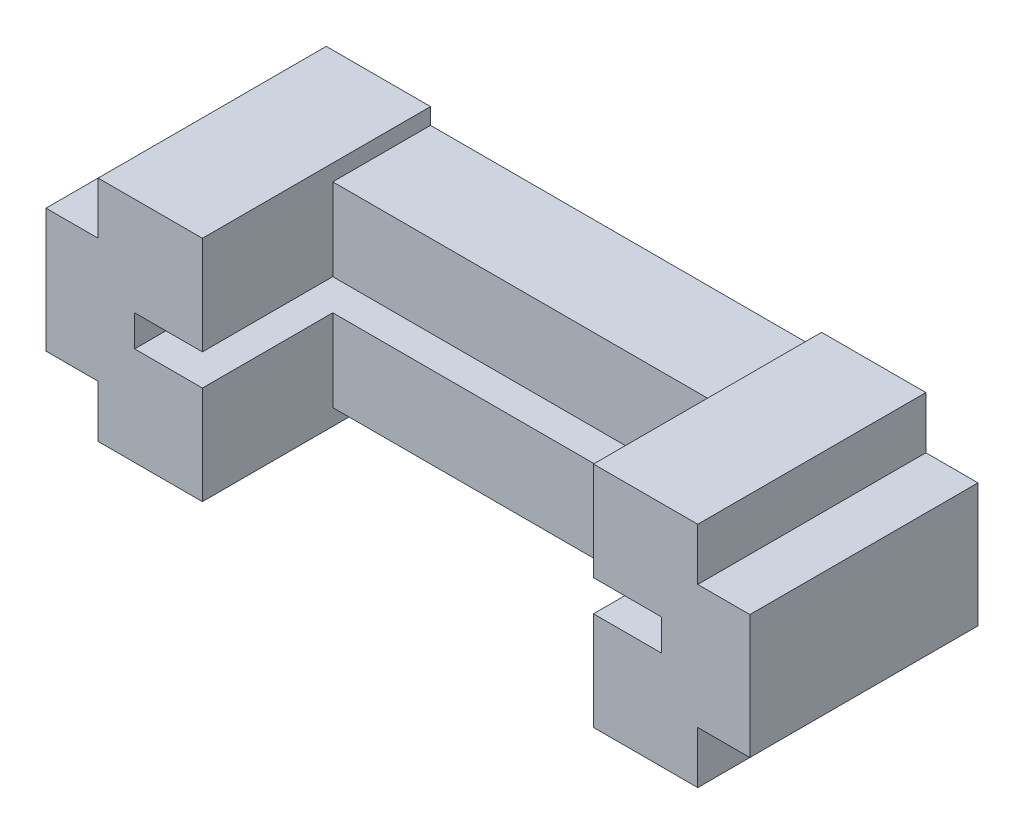
ISO-10303-21;
HEADER;
FILE_DESCRIPTION(('STEP AP214'),'2;1');
FILE_NAME('part.step','',(''),(''),'','','');
FILE_SCHEMA(('AUTOMOTIVE_DESIGN { 1 0 10303 214 1 1 1 1 }'));
ENDSEC;
DATA;
#1=APPLICATION_CONTEXT('core data for automotive mechanical design processes');
#2=APPLICATION_PROTOCOL_DEFINITION('international standard','automotive_design',2000,#1);
#3=PRODUCT_CONTEXT('',#1,'mechanical');
#4=PRODUCT('Part','Part','',(#3));
#5=PRODUCT_RELATED_PRODUCT_CATEGORY('part','',(#4));
#6=PRODUCT_DEFINITION_FORMATION('','',#4);
#7=PRODUCT_DEFINITION_CONTEXT('part definition',#1,'design');
#8=PRODUCT_DEFINITION('design','',#6,#7);
#9=PRODUCT_DEFINITION_SHAPE('','',#8);
#10=(LENGTH_UNIT() NAMED_UNIT(*) SI_UNIT(.MILLI.,.METRE.));
#11=(NAMED_UNIT(*) PLANE_ANGLE_UNIT() SI_UNIT($,.RADIAN.));
#12=(NAMED_UNIT(*) SI_UNIT($,.STERADIAN.) SOLID_ANGLE_UNIT());
#13=UNCERTAINTY_MEASURE_WITH_UNIT(LENGTH_MEASURE(1.E-05),#10,'distance_accuracy_value','');
#14=(GEOMETRIC_REPRESENTATION_CONTEXT(3) GLOBAL_UNCERTAINTY_ASSIGNED_CONTEXT((#13)) GLOBAL_UNIT_ASSIGNED_CONTEXT((#10,
#11,#12)) REPRESENTATION_CONTEXT('',''));
#15=CARTESIAN_POINT('',(0.,0.,0.));
#16=DIRECTION('',(0.,0.,1.));
#17=DIRECTION('',(1.,0.,0.));
#18=AXIS2_PLACEMENT_3D('',#15,#16,#17);
#19=CARTESIAN_POINT('',(-29.21,-11.1125,9.525));
#20=DIRECTION('',(0.,1.,0.));
#21=DIRECTION('',(-1.,0.,0.));
#22=AXIS2_PLACEMENT_3D('',#19,#20,#21);
#23=PLANE('',#22);
#24=DIRECTION('',(1.,0.,0.));
#25=VECTOR('',#24,1.);
#26=CARTESIAN_POINT('',(-29.21,-11.1125,0.));
#27=LINE('',#26,#25);
#28=CARTESIAN_POINT('',(-29.21,-11.1125,0.));
#29=VERTEX_POINT('',#28);
#30=CARTESIAN_POINT('',(-19.05,-11.1125,0.));
#31=VERTEX_POINT('',#30);
#32=EDGE_CURVE('E385',#29,#31,#27,.T.);
#33=ORIENTED_EDGE('',*,*,#32,.T.);
#34=DIRECTION('',(0.,0.,-1.));
#35=VECTOR('',#34,1.);
#36=CARTESIAN_POINT('',(-19.05,-11.1125,22.225));
#37=LINE('',#36,#35);
#38=CARTESIAN_POINT('',(-19.05,-11.1125,22.225));
#39=VERTEX_POINT('',#38);
#40=EDGE_CURVE('E358',#39,#31,#37,.T.);
#41=ORIENTED_EDGE('',*,*,#40,.F.);
#42=DIRECTION('',(1.,0.,0.));
#43=VECTOR('',#42,1.);
#44=CARTESIAN_POINT('',(-29.21,-11.1125,22.225));
#45=LINE('',#44,#43);
#46=CARTESIAN_POINT('',(-29.21,-11.1125,22.225));
#47=VERTEX_POINT('',#46);
#48=EDGE_CURVE('E356',#47,#39,#45,.T.);
#49=ORIENTED_EDGE('',*,*,#48,.F.);
#50=DIRECTION('',(0.,0.,-1.));
#51=VECTOR('',#50,1.);
#52=CARTESIAN_POINT('',(-29.21,-11.1125,9.525));
#53=LINE('',#52,#51);
#54=EDGE_CURVE('E422',#47,#29,#53,.T.);
#55=ORIENTED_EDGE('',*,*,#54,.T.);
#56=EDGE_LOOP('',(#33,#41,#49,#55));
#57=FACE_BOUND('',#56,.T.);
#58=ADVANCED_FACE('F33',(#57),#23,.F.);
#59=CARTESIAN_POINT('',(-29.21,11.1125,9.525));
#60=DIRECTION('',(0.,-1.,0.));
#61=DIRECTION('',(1.,0.,0.));
#62=AXIS2_PLACEMENT_3D('',#59,#60,#61);
#63=PLANE('',#62);
#64=DIRECTION('',(0.,0.,-1.));
#65=VECTOR('',#64,1.);
#66=CARTESIAN_POINT('',(-19.05,11.1125,22.225));
#67=LINE('',#66,#65);
#68=CARTESIAN_POINT('',(-19.05,11.1125,22.225));
#69=VERTEX_POINT('',#68);
#70=CARTESIAN_POINT('',(-19.05,11.1125,0.));
#71=VERTEX_POINT('',#70);
#72=EDGE_CURVE('E362',#69,#71,#67,.T.);
#73=ORIENTED_EDGE('',*,*,#72,.T.);
#74=DIRECTION('',(-1.,0.,0.));
#75=VECTOR('',#74,1.);
#76=CARTESIAN_POINT('',(-29.21,11.1125,0.));
#77=LINE('',#76,#75);
#78=CARTESIAN_POINT('',(-29.21,11.1125,0.));
#79=VERTEX_POINT('',#78);
#80=EDGE_CURVE('E240',#71,#79,#77,.T.);
#81=ORIENTED_EDGE('',*,*,#80,.T.);
#82=DIRECTION('',(0.,0.,-1.));
#83=VECTOR('',#82,1.);
#84=CARTESIAN_POINT('',(-29.21,11.1125,9.525));
#85=LINE('',#84,#83);
#86=CARTESIAN_POINT('',(-29.21,11.1125,22.225));
#87=VERTEX_POINT('',#86);
#88=EDGE_CURVE('E401',#87,#79,#85,.T.);
#89=ORIENTED_EDGE('',*,*,#88,.F.);
#90=DIRECTION('',(-1.,0.,0.));
#91=VECTOR('',#90,1.);
#92=CARTESIAN_POINT('',(-29.21,11.1125,22.225));
#93=LINE('',#92,#91);
#94=EDGE_CURVE('E338',#69,#87,#93,.T.);
#95=ORIENTED_EDGE('',*,*,#94,.F.);
#96=EDGE_LOOP('',(#73,#81,#89,#95));
#97=FACE_BOUND('',#96,.T.);
#98=ADVANCED_FACE('F474',(#97),#63,.F.);
#99=CARTESIAN_POINT('',(0.,0.,9.525));
#100=DIRECTION('',(0.,0.,1.));
#101=DIRECTION('',(1.,0.,0.));
#102=AXIS2_PLACEMENT_3D('',#99,#100,#101);
#103=PLANE('',#102);
#104=DIRECTION('',(1.,0.,0.));
#105=VECTOR('',#104,1.);
#106=CARTESIAN_POINT('',(0.,9.525,9.525));
#107=LINE('',#106,#105);
#108=CARTESIAN_POINT('',(-19.05,9.525,9.525));
#109=VERTEX_POINT('',#108);
#110=CARTESIAN_POINT('',(19.05,9.525,9.525));
#111=VERTEX_POINT('',#110);
#112=EDGE_CURVE('E248',#109,#111,#107,.T.);
#113=ORIENTED_EDGE('',*,*,#112,.F.);
#114=DIRECTION('',(0.,1.,0.));
#115=VECTOR('',#114,1.);
#116=CARTESIAN_POINT('',(-19.05,11.1125,9.525));
#117=LINE('',#116,#115);
#118=CARTESIAN_POINT('',(-19.05,1.524,9.525));
#119=VERTEX_POINT('',#118);
#120=EDGE_CURVE('E228',#119,#109,#117,.T.);
#121=ORIENTED_EDGE('',*,*,#120,.F.);
#122=DIRECTION('',(-1.,0.,0.));
#123=VECTOR('',#122,1.);
#124=CARTESIAN_POINT('',(-25.654,1.524,9.525));
#125=LINE('',#124,#123);
#126=CARTESIAN_POINT('',(19.05,1.524,9.525));
#127=VERTEX_POINT('',#126);
#128=EDGE_CURVE('E266',#127,#119,#125,.T.);
#129=ORIENTED_EDGE('',*,*,#128,.F.);
#130=DIRECTION('',(0.,-1.,0.));
#131=VECTOR('',#130,1.);
#132=CARTESIAN_POINT('',(19.05,11.1125,9.525));
#133=LINE('',#132,#131);
#134=EDGE_CURVE('E282',#111,#127,#133,.T.);
#135=ORIENTED_EDGE('',*,*,#134,.F.);
#136=EDGE_LOOP('',(#113,#121,#129,#135));
#137=FACE_BOUND('',#136,.T.);
#138=ADVANCED_FACE('F491',(#137),#103,.T.);
#139=DIRECTION('',(-1.,0.,0.));
#140=VECTOR('',#139,1.);
#141=CARTESIAN_POINT('',(0.,-9.525,9.525));
#142=LINE('',#141,#140);
#143=CARTESIAN_POINT('',(19.05,-9.525,9.525));
#144=VERTEX_POINT('',#143);
#145=CARTESIAN_POINT('',(-19.05,-9.525,9.525));
#146=VERTEX_POINT('',#145);
#147=EDGE_CURVE('E259',#144,#146,#142,.T.);
#148=ORIENTED_EDGE('',*,*,#147,.F.);
#149=DIRECTION('',(0.,-1.,0.));
#150=VECTOR('',#149,1.);
#151=CARTESIAN_POINT('',(19.05,-1.524,9.525));
#152=LINE('',#151,#150);
#153=CARTESIAN_POINT('',(19.05,-1.524,9.525));
#154=VERTEX_POINT('',#153);
#155=EDGE_CURVE('E275',#154,#144,#152,.T.);
#156=ORIENTED_EDGE('',*,*,#155,.F.);
#157=DIRECTION('',(1.,0.,0.));
#158=VECTOR('',#157,1.);
#159=CARTESIAN_POINT('',(-25.654,-1.524,9.525));
#160=LINE('',#159,#158);
#161=CARTESIAN_POINT('',(-19.05,-1.524,9.525));
#162=VERTEX_POINT('',#161);
#163=EDGE_CURVE('E261',#162,#154,#160,.T.);
#164=ORIENTED_EDGE('',*,*,#163,.F.);
#165=DIRECTION('',(0.,1.,0.));
#166=VECTOR('',#165,1.);
#167=CARTESIAN_POINT('',(-19.05,-1.524,9.525));
#168=LINE('',#167,#166);
#169=EDGE_CURVE('E327',#146,#162,#168,.T.);
#170=ORIENTED_EDGE('',*,*,#169,.F.);
#171=EDGE_LOOP('',(#148,#156,#164,#170));
#172=FACE_BOUND('',#171,.T.);
#173=ADVANCED_FACE('F484',(#172),#103,.T.);
#174=CARTESIAN_POINT('',(-29.21,11.1125,9.525));
#175=DIRECTION('',(1.,0.,0.));
#176=DIRECTION('',(0.,0.,-1.));
#177=AXIS2_PLACEMENT_3D('',#174,#175,#176);
#178=PLANE('',#177);
#179=DIRECTION('',(0.,-1.,0.));
#180=VECTOR('',#179,1.);
#181=CARTESIAN_POINT('',(-29.21,11.1125,0.));
#182=LINE('',#181,#180);
#183=CARTESIAN_POINT('',(-29.21,6.0325,0.));
#184=VERTEX_POINT('',#183);
#185=EDGE_CURVE('E373',#79,#184,#182,.T.);
#186=ORIENTED_EDGE('',*,*,#185,.T.);
#187=DIRECTION('',(0.,0.,-1.));
#188=VECTOR('',#187,1.);
#189=CARTESIAN_POINT('',(-29.21,6.0325,9.525));
#190=LINE('',#189,#188);
#191=CARTESIAN_POINT('',(-29.21,6.0325,22.225));
#192=VERTEX_POINT('',#191);
#193=EDGE_CURVE('E11',#192,#184,#190,.T.);
#194=ORIENTED_EDGE('',*,*,#193,.F.);
#195=DIRECTION('',(0.,-1.,0.));
#196=VECTOR('',#195,1.);
#197=CARTESIAN_POINT('',(-29.21,11.1125,22.225));
#198=LINE('',#197,#196);
#199=EDGE_CURVE('E341',#87,#192,#198,.T.);
#200=ORIENTED_EDGE('',*,*,#199,.F.);
#201=ORIENTED_EDGE('',*,*,#88,.T.);
#202=EDGE_LOOP('',(#186,#194,#200,#201));
#203=FACE_BOUND('',#202,.T.);
#204=ADVANCED_FACE('F35',(#203),#178,.F.);
#205=CARTESIAN_POINT('',(-34.29,6.0325,9.525));
#206=DIRECTION('',(0.,-1.,0.));
#207=DIRECTION('',(0.,0.,-1.));
#208=AXIS2_PLACEMENT_3D('',#205,#206,#207);
#209=PLANE('',#208);
#210=DIRECTION('',(-1.,0.,0.));
#211=VECTOR('',#210,1.);
#212=CARTESIAN_POINT('',(-34.29,6.0325,0.));
#213=LINE('',#212,#211);
#214=CARTESIAN_POINT('',(-34.29,6.0325,0.));
#215=VERTEX_POINT('',#214);
#216=EDGE_CURVE('E376',#184,#215,#213,.T.);
#217=ORIENTED_EDGE('',*,*,#216,.T.);
#218=DIRECTION('',(0.,0.,-1.));
#219=VECTOR('',#218,1.);
#220=CARTESIAN_POINT('',(-34.29,6.0325,9.525));
#221=LINE('',#220,#219);
#222=CARTESIAN_POINT('',(-34.29,6.0325,22.225));
#223=VERTEX_POINT('',#222);
#224=EDGE_CURVE('E41',#223,#215,#221,.T.);
#225=ORIENTED_EDGE('',*,*,#224,.F.);
#226=DIRECTION('',(-1.,0.,0.));
#227=VECTOR('',#226,1.);
#228=CARTESIAN_POINT('',(-34.29,6.0325,22.225));
#229=LINE('',#228,#227);
#230=EDGE_CURVE('E344',#192,#223,#229,.T.);
#231=ORIENTED_EDGE('',*,*,#230,.F.);
#232=ORIENTED_EDGE('',*,*,#193,.T.);
#233=EDGE_LOOP('',(#217,#225,#231,#232));
#234=FACE_BOUND('',#233,.T.);
#235=ADVANCED_FACE('F477',(#234),#209,.F.);
#236=CARTESIAN_POINT('',(-34.29,-6.0325,9.525));
#237=DIRECTION('',(1.,0.,0.));
#238=DIRECTION('',(0.,1.,0.));
#239=AXIS2_PLACEMENT_3D('',#236,#237,#238);
#240=PLANE('',#239);
#241=DIRECTION('',(0.,-1.,0.));
#242=VECTOR('',#241,1.);
#243=CARTESIAN_POINT('',(-34.29,-6.0325,0.));
#244=LINE('',#243,#242);
#245=CARTESIAN_POINT('',(-34.29,-6.0325,0.));
#246=VERTEX_POINT('',#245);
#247=EDGE_CURVE('E378',#215,#246,#244,.T.);
#248=ORIENTED_EDGE('',*,*,#247,.T.);
#249=DIRECTION('',(0.,0.,-1.));
#250=VECTOR('',#249,1.);
#251=CARTESIAN_POINT('',(-34.29,-6.0325,9.525));
#252=LINE('',#251,#250);
#253=CARTESIAN_POINT('',(-34.29,-6.0325,22.225));
#254=VERTEX_POINT('',#253);
#255=EDGE_CURVE('E428',#254,#246,#252,.T.);
#256=ORIENTED_EDGE('',*,*,#255,.F.);
#257=DIRECTION('',(0.,-1.,0.));
#258=VECTOR('',#257,1.);
#259=CARTESIAN_POINT('',(-34.29,6.0325,22.225));
#260=LINE('',#259,#258);
#261=EDGE_CURVE('E347',#223,#254,#260,.T.);
#262=ORIENTED_EDGE('',*,*,#261,.F.);
#263=ORIENTED_EDGE('',*,*,#224,.T.);
#264=EDGE_LOOP('',(#248,#256,#262,#263));
#265=FACE_BOUND('',#264,.T.);
#266=ADVANCED_FACE('F434',(#265),#240,.F.);
#267=CARTESIAN_POINT('',(-34.29,-6.0325,9.525));
#268=DIRECTION('',(0.,1.,0.));
#269=DIRECTION('',(0.,0.,1.));
#270=AXIS2_PLACEMENT_3D('',#267,#268,#269);
#271=PLANE('',#270);
#272=DIRECTION('',(1.,0.,0.));
#273=VECTOR('',#272,1.);
#274=CARTESIAN_POINT('',(-34.29,-6.0325,0.));
#275=LINE('',#274,#273);
#276=CARTESIAN_POINT('',(-29.21,-6.0325,0.));
#277=VERTEX_POINT('',#276);
#278=EDGE_CURVE('E380',#246,#277,#275,.T.);
#279=ORIENTED_EDGE('',*,*,#278,.T.);
#280=DIRECTION('',(0.,0.,-1.));
#281=VECTOR('',#280,1.);
#282=CARTESIAN_POINT('',(-29.21,-6.0325,9.525));
#283=LINE('',#282,#281);
#284=CARTESIAN_POINT('',(-29.21,-6.0325,22.225));
#285=VERTEX_POINT('',#284);
#286=EDGE_CURVE('E425',#285,#277,#283,.T.);
#287=ORIENTED_EDGE('',*,*,#286,.F.);
#288=DIRECTION('',(1.,0.,0.));
#289=VECTOR('',#288,1.);
#290=CARTESIAN_POINT('',(-29.21,-6.0325,22.225));
#291=LINE('',#290,#289);
#292=EDGE_CURVE('E350',#254,#285,#291,.T.);
#293=ORIENTED_EDGE('',*,*,#292,.F.);
#294=ORIENTED_EDGE('',*,*,#255,.T.);
#295=EDGE_LOOP('',(#279,#287,#293,#294));
#296=FACE_BOUND('',#295,.T.);
#297=ADVANCED_FACE('F441',(#296),#271,.F.);
#298=CARTESIAN_POINT('',(-29.21,-11.1125,9.525));
#299=DIRECTION('',(1.,0.,0.));
#300=DIRECTION('',(0.,0.,-1.));
#301=AXIS2_PLACEMENT_3D('',#298,#299,#300);
#302=PLANE('',#301);
#303=DIRECTION('',(0.,-1.,0.));
#304=VECTOR('',#303,1.);
#305=CARTESIAN_POINT('',(-29.21,-11.1125,0.));
#306=LINE('',#305,#304);
#307=EDGE_CURVE('E382',#277,#29,#306,.T.);
#308=ORIENTED_EDGE('',*,*,#307,.T.);
#309=ORIENTED_EDGE('',*,*,#54,.F.);
#310=DIRECTION('',(0.,-1.,0.));
#311=VECTOR('',#310,1.);
#312=CARTESIAN_POINT('',(-29.21,-6.0325,22.225));
#313=LINE('',#312,#311);
#314=EDGE_CURVE('E353',#285,#47,#313,.T.);
#315=ORIENTED_EDGE('',*,*,#314,.F.);
#316=ORIENTED_EDGE('',*,*,#286,.T.);
#317=EDGE_LOOP('',(#308,#309,#315,#316));
#318=FACE_BOUND('',#317,.T.);
#319=ADVANCED_FACE('F445',(#318),#302,.F.);
#320=DIRECTION('',(0.,0.,-1.));
#321=VECTOR('',#320,1.);
#322=CARTESIAN_POINT('',(19.05,-11.1125,22.225));
#323=LINE('',#322,#321);
#324=CARTESIAN_POINT('',(19.05,-11.1125,22.225));
#325=VERTEX_POINT('',#324);
#326=CARTESIAN_POINT('',(19.05,-11.1125,0.));
#327=VERTEX_POINT('',#326);
#328=EDGE_CURVE('E322',#325,#327,#323,.T.);
#329=ORIENTED_EDGE('',*,*,#328,.T.);
#330=CARTESIAN_POINT('',(29.21,-11.1125,0.));
#331=VERTEX_POINT('',#330);
#332=EDGE_CURVE('E384',#327,#331,#27,.T.);
#333=ORIENTED_EDGE('',*,*,#332,.T.);
#334=DIRECTION('',(0.,0.,-1.));
#335=VECTOR('',#334,1.);
#336=CARTESIAN_POINT('',(29.21,-11.1125,9.525));
#337=LINE('',#336,#335);
#338=CARTESIAN_POINT('',(29.21,-11.1125,22.225));
#339=VERTEX_POINT('',#338);
#340=EDGE_CURVE('E419',#339,#331,#337,.T.);
#341=ORIENTED_EDGE('',*,*,#340,.F.);
#342=DIRECTION('',(1.,0.,0.));
#343=VECTOR('',#342,1.);
#344=CARTESIAN_POINT('',(29.21,-11.1125,22.225));
#345=LINE('',#344,#343);
#346=EDGE_CURVE('E284',#325,#339,#345,.T.);
#347=ORIENTED_EDGE('',*,*,#346,.F.);
#348=EDGE_LOOP('',(#329,#333,#341,#347));
#349=FACE_BOUND('',#348,.T.);
#350=ADVANCED_FACE('F487',(#349),#23,.F.);
#351=CARTESIAN_POINT('',(29.21,-11.1125,9.525));
#352=DIRECTION('',(-1.,0.,0.));
#353=DIRECTION('',(0.,0.,1.));
#354=AXIS2_PLACEMENT_3D('',#351,#352,#353);
#355=PLANE('',#354);
#356=DIRECTION('',(0.,1.,0.));
#357=VECTOR('',#356,1.);
#358=CARTESIAN_POINT('',(29.21,-11.1125,0.));
#359=LINE('',#358,#357);
#360=CARTESIAN_POINT('',(29.21,-6.0325,0.));
#361=VERTEX_POINT('',#360);
#362=EDGE_CURVE('E388',#331,#361,#359,.T.);
#363=ORIENTED_EDGE('',*,*,#362,.T.);
#364=DIRECTION('',(0.,0.,-1.));
#365=VECTOR('',#364,1.);
#366=CARTESIAN_POINT('',(29.21,-6.0325,9.525));
#367=LINE('',#366,#365);
#368=CARTESIAN_POINT('',(29.21,-6.0325,22.225));
#369=VERTEX_POINT('',#368);
#370=EDGE_CURVE('E416',#369,#361,#367,.T.);
#371=ORIENTED_EDGE('',*,*,#370,.F.);
#372=DIRECTION('',(0.,1.,0.));
#373=VECTOR('',#372,1.);
#374=CARTESIAN_POINT('',(29.21,-11.1125,22.225));
#375=LINE('',#374,#373);
#376=EDGE_CURVE('E287',#339,#369,#375,.T.);
#377=ORIENTED_EDGE('',*,*,#376,.F.);
#378=ORIENTED_EDGE('',*,*,#340,.T.);
#379=EDGE_LOOP('',(#363,#371,#377,#378));
#380=FACE_BOUND('',#379,.T.);
#381=ADVANCED_FACE('F497',(#380),#355,.F.);
#382=CARTESIAN_POINT('',(34.29,-6.0325,9.525));
#383=DIRECTION('',(0.,1.,0.));
#384=DIRECTION('',(0.,0.,1.));
#385=AXIS2_PLACEMENT_3D('',#382,#383,#384);
#386=PLANE('',#385);
#387=DIRECTION('',(1.,0.,0.));
#388=VECTOR('',#387,1.);
#389=CARTESIAN_POINT('',(34.29,-6.0325,0.));
#390=LINE('',#389,#388);
#391=CARTESIAN_POINT('',(34.29,-6.0325,0.));
#392=VERTEX_POINT('',#391);
#393=EDGE_CURVE('E390',#361,#392,#390,.T.);
#394=ORIENTED_EDGE('',*,*,#393,.T.);
#395=DIRECTION('',(0.,0.,-1.));
#396=VECTOR('',#395,1.);
#397=CARTESIAN_POINT('',(34.29,-6.0325,9.525));
#398=LINE('',#397,#396);
#399=CARTESIAN_POINT('',(34.29,-6.0325,22.225));
#400=VERTEX_POINT('',#399);
#401=EDGE_CURVE('E413',#400,#392,#398,.T.);
#402=ORIENTED_EDGE('',*,*,#401,.F.);
#403=DIRECTION('',(1.,0.,0.));
#404=VECTOR('',#403,1.);
#405=CARTESIAN_POINT('',(34.29,-6.0325,22.225));
#406=LINE('',#405,#404);
#407=EDGE_CURVE('E290',#369,#400,#406,.T.);
#408=ORIENTED_EDGE('',*,*,#407,.F.);
#409=ORIENTED_EDGE('',*,*,#370,.T.);
#410=EDGE_LOOP('',(#394,#402,#408,#409));
#411=FACE_BOUND('',#410,.T.);
#412=ADVANCED_FACE('F503',(#411),#386,.F.);
#413=CARTESIAN_POINT('',(34.29,-6.0325,9.525));
#414=DIRECTION('',(-1.,0.,0.));
#415=DIRECTION('',(0.,-1.,0.));
#416=AXIS2_PLACEMENT_3D('',#413,#414,#415);
#417=PLANE('',#416);
#418=DIRECTION('',(0.,1.,0.));
#419=VECTOR('',#418,1.);
#420=CARTESIAN_POINT('',(34.29,-6.0325,0.));
#421=LINE('',#420,#419);
#422=CARTESIAN_POINT('',(34.29,6.0325,0.));
#423=VERTEX_POINT('',#422);
#424=EDGE_CURVE('E392',#392,#423,#421,.T.);
#425=ORIENTED_EDGE('',*,*,#424,.T.);
#426=DIRECTION('',(0.,0.,-1.));
#427=VECTOR('',#426,1.);
#428=CARTESIAN_POINT('',(34.29,6.0325,9.525));
#429=LINE('',#428,#427);
#430=CARTESIAN_POINT('',(34.29,6.0325,22.225));
#431=VERTEX_POINT('',#430);
#432=EDGE_CURVE('E410',#431,#423,#429,.T.);
#433=ORIENTED_EDGE('',*,*,#432,.F.);
#434=DIRECTION('',(0.,1.,0.));
#435=VECTOR('',#434,1.);
#436=CARTESIAN_POINT('',(34.29,6.0325,22.225));
#437=LINE('',#436,#435);
#438=EDGE_CURVE('E293',#400,#431,#437,.T.);
#439=ORIENTED_EDGE('',*,*,#438,.F.);
#440=ORIENTED_EDGE('',*,*,#401,.T.);
#441=EDGE_LOOP('',(#425,#433,#439,#440));
#442=FACE_BOUND('',#441,.T.);
#443=ADVANCED_FACE('F522',(#442),#417,.F.);
#444=CARTESIAN_POINT('',(34.29,6.0325,9.525));
#445=DIRECTION('',(0.,-1.,0.));
#446=DIRECTION('',(0.,0.,-1.));
#447=AXIS2_PLACEMENT_3D('',#444,#445,#446);
#448=PLANE('',#447);
#449=DIRECTION('',(-1.,0.,0.));
#450=VECTOR('',#449,1.);
#451=CARTESIAN_POINT('',(34.29,6.0325,0.));
#452=LINE('',#451,#450);
#453=CARTESIAN_POINT('',(29.21,6.0325,0.));
#454=VERTEX_POINT('',#453);
#455=EDGE_CURVE('E394',#423,#454,#452,.T.);
#456=ORIENTED_EDGE('',*,*,#455,.T.);
#457=DIRECTION('',(0.,0.,-1.));
#458=VECTOR('',#457,1.);
#459=CARTESIAN_POINT('',(29.21,6.0325,9.525));
#460=LINE('',#459,#458);
#461=CARTESIAN_POINT('',(29.21,6.0325,22.225));
#462=VERTEX_POINT('',#461);
#463=EDGE_CURVE('E407',#462,#454,#460,.T.);
#464=ORIENTED_EDGE('',*,*,#463,.F.);
#465=DIRECTION('',(-1.,0.,0.));
#466=VECTOR('',#465,1.);
#467=CARTESIAN_POINT('',(34.29,6.0325,22.225));
#468=LINE('',#467,#466);
#469=EDGE_CURVE('E296',#431,#462,#468,.T.);
#470=ORIENTED_EDGE('',*,*,#469,.F.);
#471=ORIENTED_EDGE('',*,*,#432,.T.);
#472=EDGE_LOOP('',(#456,#464,#470,#471));
#473=FACE_BOUND('',#472,.T.);
#474=ADVANCED_FACE('F525',(#473),#448,.F.);
#475=CARTESIAN_POINT('',(29.21,11.1125,9.525));
#476=DIRECTION('',(-1.,0.,0.));
#477=DIRECTION('',(0.,0.,1.));
#478=AXIS2_PLACEMENT_3D('',#475,#476,#477);
#479=PLANE('',#478);
#480=DIRECTION('',(0.,1.,0.));
#481=VECTOR('',#480,1.);
#482=CARTESIAN_POINT('',(29.21,11.1125,0.));
#483=LINE('',#482,#481);
#484=CARTESIAN_POINT('',(29.21,11.1125,0.));
#485=VERTEX_POINT('',#484);
#486=EDGE_CURVE('E396',#454,#485,#483,.T.);
#487=ORIENTED_EDGE('',*,*,#486,.T.);
#488=DIRECTION('',(0.,0.,-1.));
#489=VECTOR('',#488,1.);
#490=CARTESIAN_POINT('',(29.21,11.1125,9.525));
#491=LINE('',#490,#489);
#492=CARTESIAN_POINT('',(29.21,11.1125,22.225));
#493=VERTEX_POINT('',#492);
#494=EDGE_CURVE('E404',#493,#485,#491,.T.);
#495=ORIENTED_EDGE('',*,*,#494,.F.);
#496=DIRECTION('',(0.,1.,0.));
#497=VECTOR('',#496,1.);
#498=CARTESIAN_POINT('',(29.21,11.1125,22.225));
#499=LINE('',#498,#497);
#500=EDGE_CURVE('E299',#462,#493,#499,.T.);
#501=ORIENTED_EDGE('',*,*,#500,.F.);
#502=ORIENTED_EDGE('',*,*,#463,.T.);
#503=EDGE_LOOP('',(#487,#495,#501,#502));
#504=FACE_BOUND('',#503,.T.);
#505=ADVANCED_FACE('F529',(#504),#479,.F.);
#506=CARTESIAN_POINT('',(19.05,11.1125,0.));
#507=VERTEX_POINT('',#506);
#508=EDGE_CURVE('E398',#485,#507,#77,.T.);
#509=ORIENTED_EDGE('',*,*,#508,.T.);
#510=DIRECTION('',(0.,0.,-1.));
#511=VECTOR('',#510,1.);
#512=CARTESIAN_POINT('',(19.05,11.1125,22.225));
#513=LINE('',#512,#511);
#514=CARTESIAN_POINT('',(19.05,11.1125,22.225));
#515=VERTEX_POINT('',#514);
#516=EDGE_CURVE('E320',#515,#507,#513,.T.);
#517=ORIENTED_EDGE('',*,*,#516,.F.);
#518=DIRECTION('',(-1.,0.,0.));
#519=VECTOR('',#518,1.);
#520=CARTESIAN_POINT('',(29.21,11.1125,22.225));
#521=LINE('',#520,#519);
#522=EDGE_CURVE('E302',#493,#515,#521,.T.);
#523=ORIENTED_EDGE('',*,*,#522,.F.);
#524=ORIENTED_EDGE('',*,*,#494,.T.);
#525=EDGE_LOOP('',(#509,#517,#523,#524));
#526=FACE_BOUND('',#525,.T.);
#527=ADVANCED_FACE('F493',(#526),#63,.F.);
#528=CARTESIAN_POINT('',(0.,0.,0.));
#529=DIRECTION('',(0.,0.,1.));
#530=DIRECTION('',(1.,0.,0.));
#531=AXIS2_PLACEMENT_3D('',#528,#529,#530);
#532=PLANE('',#531);
#533=ORIENTED_EDGE('',*,*,#80,.F.);
#534=DIRECTION('',(0.,-1.,0.));
#535=VECTOR('',#534,1.);
#536=CARTESIAN_POINT('',(-19.05,11.1125,0.));
#537=LINE('',#536,#535);
#538=CARTESIAN_POINT('',(-19.05,9.525,0.));
#539=VERTEX_POINT('',#538);
#540=EDGE_CURVE('E224',#71,#539,#537,.T.);
#541=ORIENTED_EDGE('',*,*,#540,.T.);
#542=DIRECTION('',(1.,0.,0.));
#543=VECTOR('',#542,1.);
#544=CARTESIAN_POINT('',(-19.05,9.525,0.));
#545=LINE('',#544,#543);
#546=CARTESIAN_POINT('',(19.05,9.525,0.));
#547=VERTEX_POINT('',#546);
#548=EDGE_CURVE('E234',#539,#547,#545,.T.);
#549=ORIENTED_EDGE('',*,*,#548,.T.);
#550=DIRECTION('',(0.,1.,0.));
#551=VECTOR('',#550,1.);
#552=CARTESIAN_POINT('',(19.05,11.1125,0.));
#553=LINE('',#552,#551);
#554=EDGE_CURVE('E48',#547,#507,#553,.T.);
#555=ORIENTED_EDGE('',*,*,#554,.T.);
#556=ORIENTED_EDGE('',*,*,#508,.F.);
#557=ORIENTED_EDGE('',*,*,#486,.F.);
#558=ORIENTED_EDGE('',*,*,#455,.F.);
#559=ORIENTED_EDGE('',*,*,#424,.F.);
#560=ORIENTED_EDGE('',*,*,#393,.F.);
#561=ORIENTED_EDGE('',*,*,#362,.F.);
#562=ORIENTED_EDGE('',*,*,#332,.F.);
#563=DIRECTION('',(0.,1.,0.));
#564=VECTOR('',#563,1.);
#565=CARTESIAN_POINT('',(19.05,-11.1125,0.));
#566=LINE('',#565,#564);
#567=CARTESIAN_POINT('',(19.05,-9.525,0.));
#568=VERTEX_POINT('',#567);
#569=EDGE_CURVE('E250',#327,#568,#566,.T.);
#570=ORIENTED_EDGE('',*,*,#569,.T.);
#571=DIRECTION('',(-1.,0.,0.));
#572=VECTOR('',#571,1.);
#573=CARTESIAN_POINT('',(-19.05,-9.525,0.));
#574=LINE('',#573,#572);
#575=CARTESIAN_POINT('',(-19.05,-9.525,0.));
#576=VERTEX_POINT('',#575);
#577=EDGE_CURVE('E56',#568,#576,#574,.T.);
#578=ORIENTED_EDGE('',*,*,#577,.T.);
#579=DIRECTION('',(0.,-1.,0.));
#580=VECTOR('',#579,1.);
#581=CARTESIAN_POINT('',(-19.05,-11.1125,0.));
#582=LINE('',#581,#580);
#583=EDGE_CURVE('E254',#576,#31,#582,.T.);
#584=ORIENTED_EDGE('',*,*,#583,.T.);
#585=ORIENTED_EDGE('',*,*,#32,.F.);
#586=ORIENTED_EDGE('',*,*,#307,.F.);
#587=ORIENTED_EDGE('',*,*,#278,.F.);
#588=ORIENTED_EDGE('',*,*,#247,.F.);
#589=ORIENTED_EDGE('',*,*,#216,.F.);
#590=ORIENTED_EDGE('',*,*,#185,.F.);
#591=EDGE_LOOP('',(#533,#541,#549,#555,#556,#557,#558,#559,#560,#561,#562,#570,#578,#584,#585,
#586,#587,#588,#589,#590));
#592=FACE_BOUND('',#591,.T.);
#593=ADVANCED_FACE('F238',(#592),#532,.F.);
#594=CARTESIAN_POINT('',(-19.05,-1.524,22.225));
#595=DIRECTION('',(-1.,0.,0.));
#596=DIRECTION('',(0.,-1.,0.));
#597=AXIS2_PLACEMENT_3D('',#594,#595,#596);
#598=PLANE('',#597);
#599=DIRECTION('',(0.,0.,-1.));
#600=VECTOR('',#599,1.);
#601=CARTESIAN_POINT('',(-19.05,-1.524,22.225));
#602=LINE('',#601,#600);
#603=CARTESIAN_POINT('',(-19.05,-1.524,22.225));
#604=VERTEX_POINT('',#603);
#605=EDGE_CURVE('E370',#604,#162,#602,.T.);
#606=ORIENTED_EDGE('',*,*,#605,.F.);
#607=DIRECTION('',(0.,1.,0.));
#608=VECTOR('',#607,1.);
#609=CARTESIAN_POINT('',(-19.05,-1.524,22.225));
#610=LINE('',#609,#608);
#611=EDGE_CURVE('E328',#39,#604,#610,.T.);
#612=ORIENTED_EDGE('',*,*,#611,.F.);
#613=ORIENTED_EDGE('',*,*,#40,.T.);
#614=ORIENTED_EDGE('',*,*,#583,.F.);
#615=DIRECTION('',(0.,0.,1.));
#616=VECTOR('',#615,1.);
#617=CARTESIAN_POINT('',(-19.05,-9.525,0.));
#618=LINE('',#617,#616);
#619=EDGE_CURVE('E241',#576,#146,#618,.T.);
#620=ORIENTED_EDGE('',*,*,#619,.T.);
#621=ORIENTED_EDGE('',*,*,#169,.T.);
#622=EDGE_LOOP('',(#606,#612,#613,#614,#620,#621));
#623=FACE_BOUND('',#622,.T.);
#624=ADVANCED_FACE('F455',(#623),#598,.F.);
#625=CARTESIAN_POINT('',(-19.05,-1.524,22.225));
#626=DIRECTION('',(0.,-1.,0.));
#627=DIRECTION('',(1.,0.,0.));
#628=AXIS2_PLACEMENT_3D('',#625,#626,#627);
#629=PLANE('',#628);
#630=ORIENTED_EDGE('',*,*,#605,.T.);
#631=ORIENTED_EDGE('',*,*,#163,.T.);
#632=DIRECTION('',(0.,0.,-1.));
#633=VECTOR('',#632,1.);
#634=CARTESIAN_POINT('',(19.05,-1.524,22.225));
#635=LINE('',#634,#633);
#636=CARTESIAN_POINT('',(19.05,-1.524,22.225));
#637=VERTEX_POINT('',#636);
#638=EDGE_CURVE('E324',#637,#154,#635,.T.);
#639=ORIENTED_EDGE('',*,*,#638,.F.);
#640=DIRECTION('',(-1.,0.,0.));
#641=VECTOR('',#640,1.);
#642=CARTESIAN_POINT('',(19.05,-1.524,22.225));
#643=LINE('',#642,#641);
#644=CARTESIAN_POINT('',(25.654,-1.524,22.225));
#645=VERTEX_POINT('',#644);
#646=EDGE_CURVE('E278',#645,#637,#643,.T.);
#647=ORIENTED_EDGE('',*,*,#646,.F.);
#648=DIRECTION('',(0.,0.,-1.));
#649=VECTOR('',#648,1.);
#650=CARTESIAN_POINT('',(25.654,-1.524,22.225));
#651=LINE('',#650,#649);
#652=CARTESIAN_POINT('',(25.654,-1.524,3.429));
#653=VERTEX_POINT('',#652);
#654=EDGE_CURVE('E310',#645,#653,#651,.T.);
#655=ORIENTED_EDGE('',*,*,#654,.T.);
#656=DIRECTION('',(1.,0.,0.));
#657=VECTOR('',#656,1.);
#658=CARTESIAN_POINT('',(-25.654,-1.524,3.429));
#659=LINE('',#658,#657);
#660=CARTESIAN_POINT('',(-25.654,-1.524,3.429));
#661=VERTEX_POINT('',#660);
#662=EDGE_CURVE('E265',#661,#653,#659,.T.);
#663=ORIENTED_EDGE('',*,*,#662,.F.);
#664=DIRECTION('',(0.,0.,-1.));
#665=VECTOR('',#664,1.);
#666=CARTESIAN_POINT('',(-25.654,-1.524,22.225));
#667=LINE('',#666,#665);
#668=CARTESIAN_POINT('',(-25.654,-1.524,22.225));
#669=VERTEX_POINT('',#668);
#670=EDGE_CURVE('E368',#669,#661,#667,.T.);
#671=ORIENTED_EDGE('',*,*,#670,.F.);
#672=DIRECTION('',(-1.,0.,0.));
#673=VECTOR('',#672,1.);
#674=CARTESIAN_POINT('',(-19.05,-1.524,22.225));
#675=LINE('',#674,#673);
#676=EDGE_CURVE('E330',#604,#669,#675,.T.);
#677=ORIENTED_EDGE('',*,*,#676,.F.);
#678=EDGE_LOOP('',(#630,#631,#639,#647,#655,#663,#671,#677));
#679=FACE_BOUND('',#678,.T.);
#680=ADVANCED_FACE('F459',(#679),#629,.F.);
#681=CARTESIAN_POINT('',(-25.654,1.524,22.225));
#682=DIRECTION('',(-1.,0.,0.));
#683=DIRECTION('',(0.,0.,1.));
#684=AXIS2_PLACEMENT_3D('',#681,#682,#683);
#685=PLANE('',#684);
#686=ORIENTED_EDGE('',*,*,#670,.T.);
#687=DIRECTION('',(0.,-1.,0.));
#688=VECTOR('',#687,1.);
#689=CARTESIAN_POINT('',(-25.654,-1.524,3.429));
#690=LINE('',#689,#688);
#691=CARTESIAN_POINT('',(-25.654,1.524,3.429));
#692=VERTEX_POINT('',#691);
#693=EDGE_CURVE('E262',#692,#661,#690,.T.);
#694=ORIENTED_EDGE('',*,*,#693,.F.);
#695=DIRECTION('',(0.,0.,-1.));
#696=VECTOR('',#695,1.);
#697=CARTESIAN_POINT('',(-25.654,1.524,22.225));
#698=LINE('',#697,#696);
#699=CARTESIAN_POINT('',(-25.654,1.524,22.225));
#700=VERTEX_POINT('',#699);
#701=EDGE_CURVE('E366',#700,#692,#698,.T.);
#702=ORIENTED_EDGE('',*,*,#701,.F.);
#703=DIRECTION('',(0.,1.,0.));
#704=VECTOR('',#703,1.);
#705=CARTESIAN_POINT('',(-25.654,1.524,22.225));
#706=LINE('',#705,#704);
#707=EDGE_CURVE('E332',#669,#700,#706,.T.);
#708=ORIENTED_EDGE('',*,*,#707,.F.);
#709=EDGE_LOOP('',(#686,#694,#702,#708));
#710=FACE_BOUND('',#709,.T.);
#711=ADVANCED_FACE('F465',(#710),#685,.F.);
#712=CARTESIAN_POINT('',(-19.05,1.524,22.225));
#713=DIRECTION('',(0.,1.,0.));
#714=DIRECTION('',(-1.,0.,0.));
#715=AXIS2_PLACEMENT_3D('',#712,#713,#714);
#716=PLANE('',#715);
#717=ORIENTED_EDGE('',*,*,#701,.T.);
#718=DIRECTION('',(-1.,0.,0.));
#719=VECTOR('',#718,1.);
#720=CARTESIAN_POINT('',(-25.654,1.524,3.429));
#721=LINE('',#720,#719);
#722=CARTESIAN_POINT('',(25.654,1.524,3.429));
#723=VERTEX_POINT('',#722);
#724=EDGE_CURVE('E272',#723,#692,#721,.T.);
#725=ORIENTED_EDGE('',*,*,#724,.F.);
#726=DIRECTION('',(0.,0.,-1.));
#727=VECTOR('',#726,1.);
#728=CARTESIAN_POINT('',(25.654,1.524,22.225));
#729=LINE('',#728,#727);
#730=CARTESIAN_POINT('',(25.654,1.524,22.225));
#731=VERTEX_POINT('',#730);
#732=EDGE_CURVE('E315',#731,#723,#729,.T.);
#733=ORIENTED_EDGE('',*,*,#732,.F.);
#734=DIRECTION('',(1.,0.,0.));
#735=VECTOR('',#734,1.);
#736=CARTESIAN_POINT('',(19.05,1.524,22.225));
#737=LINE('',#736,#735);
#738=CARTESIAN_POINT('',(19.05,1.524,22.225));
#739=VERTEX_POINT('',#738);
#740=EDGE_CURVE('E306',#739,#731,#737,.T.);
#741=ORIENTED_EDGE('',*,*,#740,.F.);
#742=DIRECTION('',(0.,0.,-1.));
#743=VECTOR('',#742,1.);
#744=CARTESIAN_POINT('',(19.05,1.524,22.225));
#745=LINE('',#744,#743);
#746=EDGE_CURVE('E317',#739,#127,#745,.T.);
#747=ORIENTED_EDGE('',*,*,#746,.T.);
#748=ORIENTED_EDGE('',*,*,#128,.T.);
#749=DIRECTION('',(0.,0.,-1.));
#750=VECTOR('',#749,1.);
#751=CARTESIAN_POINT('',(-19.05,1.524,22.225));
#752=LINE('',#751,#750);
#753=CARTESIAN_POINT('',(-19.05,1.524,22.225));
#754=VERTEX_POINT('',#753);
#755=EDGE_CURVE('E364',#754,#119,#752,.T.);
#756=ORIENTED_EDGE('',*,*,#755,.F.);
#757=DIRECTION('',(1.,0.,0.));
#758=VECTOR('',#757,1.);
#759=CARTESIAN_POINT('',(-19.05,1.524,22.225));
#760=LINE('',#759,#758);
#761=EDGE_CURVE('E334',#700,#754,#760,.T.);
#762=ORIENTED_EDGE('',*,*,#761,.F.);
#763=EDGE_LOOP('',(#717,#725,#733,#741,#747,#748,#756,#762));
#764=FACE_BOUND('',#763,.T.);
#765=ADVANCED_FACE('F470',(#764),#716,.F.);
#766=CARTESIAN_POINT('',(-19.05,11.1125,22.225));
#767=DIRECTION('',(-1.,0.,0.));
#768=DIRECTION('',(0.,-1.,0.));
#769=AXIS2_PLACEMENT_3D('',#766,#767,#768);
#770=PLANE('',#769);
#771=ORIENTED_EDGE('',*,*,#120,.T.);
#772=DIRECTION('',(0.,0.,1.));
#773=VECTOR('',#772,1.);
#774=CARTESIAN_POINT('',(-19.05,9.525,0.));
#775=LINE('',#774,#773);
#776=EDGE_CURVE('E219',#539,#109,#775,.T.);
#777=ORIENTED_EDGE('',*,*,#776,.F.);
#778=ORIENTED_EDGE('',*,*,#540,.F.);
#779=ORIENTED_EDGE('',*,*,#72,.F.);
#780=DIRECTION('',(0.,1.,0.));
#781=VECTOR('',#780,1.);
#782=CARTESIAN_POINT('',(-19.05,11.1125,22.225));
#783=LINE('',#782,#781);
#784=EDGE_CURVE('E336',#754,#69,#783,.T.);
#785=ORIENTED_EDGE('',*,*,#784,.F.);
#786=ORIENTED_EDGE('',*,*,#755,.T.);
#787=EDGE_LOOP('',(#771,#777,#778,#779,#785,#786));
#788=FACE_BOUND('',#787,.T.);
#789=ADVANCED_FACE('F221',(#788),#770,.F.);
#790=CARTESIAN_POINT('',(0.,0.,22.225));
#791=DIRECTION('',(0.,0.,1.));
#792=DIRECTION('',(1.,0.,0.));
#793=AXIS2_PLACEMENT_3D('',#790,#791,#792);
#794=PLANE('',#793);
#795=ORIENTED_EDGE('',*,*,#611,.T.);
#796=ORIENTED_EDGE('',*,*,#676,.T.);
#797=ORIENTED_EDGE('',*,*,#707,.T.);
#798=ORIENTED_EDGE('',*,*,#761,.T.);
#799=ORIENTED_EDGE('',*,*,#784,.T.);
#800=ORIENTED_EDGE('',*,*,#94,.T.);
#801=ORIENTED_EDGE('',*,*,#199,.T.);
#802=ORIENTED_EDGE('',*,*,#230,.T.);
#803=ORIENTED_EDGE('',*,*,#261,.T.);
#804=ORIENTED_EDGE('',*,*,#292,.T.);
#805=ORIENTED_EDGE('',*,*,#314,.T.);
#806=ORIENTED_EDGE('',*,*,#48,.T.);
#807=EDGE_LOOP('',(#795,#796,#797,#798,#799,#800,#801,#802,#803,#804,#805,#806));
#808=FACE_BOUND('',#807,.T.);
#809=ADVANCED_FACE('F448',(#808),#794,.T.);
#810=CARTESIAN_POINT('',(19.05,-1.524,22.225));
#811=DIRECTION('',(1.,0.,0.));
#812=DIRECTION('',(0.,1.,0.));
#813=AXIS2_PLACEMENT_3D('',#810,#811,#812);
#814=PLANE('',#813);
#815=ORIENTED_EDGE('',*,*,#155,.T.);
#816=DIRECTION('',(0.,0.,1.));
#817=VECTOR('',#816,1.);
#818=CARTESIAN_POINT('',(19.05,-9.525,0.));
#819=LINE('',#818,#817);
#820=EDGE_CURVE('E244',#568,#144,#819,.T.);
#821=ORIENTED_EDGE('',*,*,#820,.F.);
#822=ORIENTED_EDGE('',*,*,#569,.F.);
#823=ORIENTED_EDGE('',*,*,#328,.F.);
#824=DIRECTION('',(0.,-1.,0.));
#825=VECTOR('',#824,1.);
#826=CARTESIAN_POINT('',(19.05,-1.524,22.225));
#827=LINE('',#826,#825);
#828=EDGE_CURVE('E281',#637,#325,#827,.T.);
#829=ORIENTED_EDGE('',*,*,#828,.F.);
#830=ORIENTED_EDGE('',*,*,#638,.T.);
#831=EDGE_LOOP('',(#815,#821,#822,#823,#829,#830));
#832=FACE_BOUND('',#831,.T.);
#833=ADVANCED_FACE('F510',(#832),#814,.F.);
#834=CARTESIAN_POINT('',(19.05,11.1125,22.225));
#835=DIRECTION('',(1.,0.,0.));
#836=DIRECTION('',(0.,1.,0.));
#837=AXIS2_PLACEMENT_3D('',#834,#835,#836);
#838=PLANE('',#837);
#839=ORIENTED_EDGE('',*,*,#746,.F.);
#840=DIRECTION('',(0.,-1.,0.));
#841=VECTOR('',#840,1.);
#842=CARTESIAN_POINT('',(19.05,11.1125,22.225));
#843=LINE('',#842,#841);
#844=EDGE_CURVE('E304',#515,#739,#843,.T.);
#845=ORIENTED_EDGE('',*,*,#844,.F.);
#846=ORIENTED_EDGE('',*,*,#516,.T.);
#847=ORIENTED_EDGE('',*,*,#554,.F.);
#848=DIRECTION('',(0.,0.,1.));
#849=VECTOR('',#848,1.);
#850=CARTESIAN_POINT('',(19.05,9.525,0.));
#851=LINE('',#850,#849);
#852=EDGE_CURVE('E231',#547,#111,#851,.T.);
#853=ORIENTED_EDGE('',*,*,#852,.T.);
#854=ORIENTED_EDGE('',*,*,#134,.T.);
#855=EDGE_LOOP('',(#839,#845,#846,#847,#853,#854));
#856=FACE_BOUND('',#855,.T.);
#857=ADVANCED_FACE('F538',(#856),#838,.F.);
#858=CARTESIAN_POINT('',(25.654,1.524,22.225));
#859=DIRECTION('',(1.,0.,0.));
#860=DIRECTION('',(0.,0.,-1.));
#861=AXIS2_PLACEMENT_3D('',#858,#859,#860);
#862=PLANE('',#861);
#863=ORIENTED_EDGE('',*,*,#732,.T.);
#864=DIRECTION('',(0.,1.,0.));
#865=VECTOR('',#864,1.);
#866=CARTESIAN_POINT('',(25.654,-1.524,3.429));
#867=LINE('',#866,#865);
#868=EDGE_CURVE('E269',#653,#723,#867,.T.);
#869=ORIENTED_EDGE('',*,*,#868,.F.);
#870=ORIENTED_EDGE('',*,*,#654,.F.);
#871=DIRECTION('',(0.,-1.,0.));
#872=VECTOR('',#871,1.);
#873=CARTESIAN_POINT('',(25.654,1.524,22.225));
#874=LINE('',#873,#872);
#875=EDGE_CURVE('E308',#731,#645,#874,.T.);
#876=ORIENTED_EDGE('',*,*,#875,.F.);
#877=EDGE_LOOP('',(#863,#869,#870,#876));
#878=FACE_BOUND('',#877,.T.);
#879=ADVANCED_FACE('F545',(#878),#862,.F.);
#880=CARTESIAN_POINT('',(0.,0.,22.225));
#881=DIRECTION('',(0.,0.,-1.));
#882=DIRECTION('',(-1.,0.,0.));
#883=AXIS2_PLACEMENT_3D('',#880,#881,#882);
#884=PLANE('',#883);
#885=ORIENTED_EDGE('',*,*,#646,.T.);
#886=ORIENTED_EDGE('',*,*,#828,.T.);
#887=ORIENTED_EDGE('',*,*,#346,.T.);
#888=ORIENTED_EDGE('',*,*,#376,.T.);
#889=ORIENTED_EDGE('',*,*,#407,.T.);
#890=ORIENTED_EDGE('',*,*,#438,.T.);
#891=ORIENTED_EDGE('',*,*,#469,.T.);
#892=ORIENTED_EDGE('',*,*,#500,.T.);
#893=ORIENTED_EDGE('',*,*,#522,.T.);
#894=ORIENTED_EDGE('',*,*,#844,.T.);
#895=ORIENTED_EDGE('',*,*,#740,.T.);
#896=ORIENTED_EDGE('',*,*,#875,.T.);
#897=EDGE_LOOP('',(#885,#886,#887,#888,#889,#890,#891,#892,#893,#894,#895,#896));
#898=FACE_BOUND('',#897,.T.);
#899=ADVANCED_FACE('F519',(#898),#884,.F.);
#900=CARTESIAN_POINT('',(0.,0.,3.429));
#901=DIRECTION('',(0.,0.,-1.));
#902=DIRECTION('',(-1.,0.,0.));
#903=AXIS2_PLACEMENT_3D('',#900,#901,#902);
#904=PLANE('',#903);
#905=ORIENTED_EDGE('',*,*,#693,.T.);
#906=ORIENTED_EDGE('',*,*,#662,.T.);
#907=ORIENTED_EDGE('',*,*,#868,.T.);
#908=ORIENTED_EDGE('',*,*,#724,.T.);
#909=EDGE_LOOP('',(#905,#906,#907,#908));
#910=FACE_BOUND('',#909,.T.);
#911=ADVANCED_FACE('F555',(#910),#904,.F.);
#912=CARTESIAN_POINT('',(-19.05,-9.525,0.));
#913=DIRECTION('',(0.,1.,0.));
#914=DIRECTION('',(0.,0.,1.));
#915=AXIS2_PLACEMENT_3D('',#912,#913,#914);
#916=PLANE('',#915);
#917=ORIENTED_EDGE('',*,*,#147,.T.);
#918=ORIENTED_EDGE('',*,*,#619,.F.);
#919=ORIENTED_EDGE('',*,*,#577,.F.);
#920=ORIENTED_EDGE('',*,*,#820,.T.);
#921=EDGE_LOOP('',(#917,#918,#919,#920));
#922=FACE_BOUND('',#921,.T.);
#923=ADVANCED_FACE('F553',(#922),#916,.F.);
#924=CARTESIAN_POINT('',(-19.05,9.525,0.));
#925=DIRECTION('',(0.,-1.,0.));
#926=DIRECTION('',(0.,0.,-1.));
#927=AXIS2_PLACEMENT_3D('',#924,#925,#926);
#928=PLANE('',#927);
#929=ORIENTED_EDGE('',*,*,#112,.T.);
#930=ORIENTED_EDGE('',*,*,#852,.F.);
#931=ORIENTED_EDGE('',*,*,#548,.F.);
#932=ORIENTED_EDGE('',*,*,#776,.T.);
#933=EDGE_LOOP('',(#929,#930,#931,#932));
#934=FACE_BOUND('',#933,.T.);
#935=ADVANCED_FACE('F235',(#934),#928,.F.);
#936=CLOSED_SHELL('',(#58,#98,#138,#173,#204,#235,#266,#297,#319,#350,#381,#412,#443,#474,#505,
#527,#593,#624,#680,#711,#765,#789,#809,#833,#857,#879,#899,#911,#923,#935));
#937=MANIFOLD_SOLID_BREP('B2',#936);
#938=ADVANCED_BREP_SHAPE_REPRESENTATION('',(#18,#937),#14);
#939=SHAPE_DEFINITION_REPRESENTATION(#9,#938);
ENDSEC;
END-ISO-10303-21;
